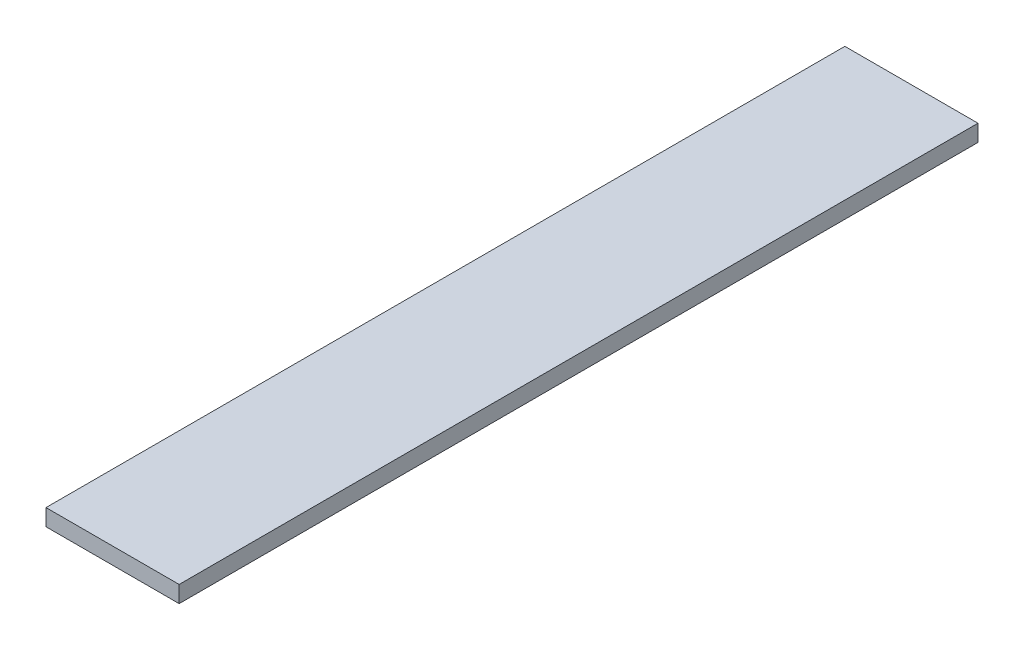
ISO-10303-21;
HEADER;
FILE_DESCRIPTION(('STEP AP214'),'2;1');
FILE_NAME('part.step','',(''),(''),'','','');
FILE_SCHEMA(('AUTOMOTIVE_DESIGN { 1 0 10303 214 1 1 1 1 }'));
ENDSEC;
DATA;
#1=APPLICATION_CONTEXT('core data for automotive mechanical design processes');
#2=APPLICATION_PROTOCOL_DEFINITION('international standard','automotive_design',2000,#1);
#3=PRODUCT_CONTEXT('',#1,'mechanical');
#4=PRODUCT('Part','Part','',(#3));
#5=PRODUCT_RELATED_PRODUCT_CATEGORY('part','',(#4));
#6=PRODUCT_DEFINITION_FORMATION('','',#4);
#7=PRODUCT_DEFINITION_CONTEXT('part definition',#1,'design');
#8=PRODUCT_DEFINITION('design','',#6,#7);
#9=PRODUCT_DEFINITION_SHAPE('','',#8);
#10=(LENGTH_UNIT() NAMED_UNIT(*) SI_UNIT(.MILLI.,.METRE.));
#11=(NAMED_UNIT(*) PLANE_ANGLE_UNIT() SI_UNIT($,.RADIAN.));
#12=(NAMED_UNIT(*) SI_UNIT($,.STERADIAN.) SOLID_ANGLE_UNIT());
#13=UNCERTAINTY_MEASURE_WITH_UNIT(LENGTH_MEASURE(1.E-05),#10,'distance_accuracy_value','');
#14=(GEOMETRIC_REPRESENTATION_CONTEXT(3) GLOBAL_UNCERTAINTY_ASSIGNED_CONTEXT((#13)) GLOBAL_UNIT_ASSIGNED_CONTEXT((#10,
#11,#12)) REPRESENTATION_CONTEXT('',''));
#15=CARTESIAN_POINT('',(0.,0.,0.));
#16=DIRECTION('',(0.,0.,1.));
#17=DIRECTION('',(1.,0.,0.));
#18=AXIS2_PLACEMENT_3D('',#15,#16,#17);
#19=CARTESIAN_POINT('',(-12.7,1.5875,76.2));
#20=DIRECTION('',(1.,0.,0.));
#21=DIRECTION('',(0.,0.,-1.));
#22=AXIS2_PLACEMENT_3D('',#19,#20,#21);
#23=PLANE('',#22);
#24=DIRECTION('',(0.,0.,-1.));
#25=VECTOR('',#24,1.);
#26=CARTESIAN_POINT('',(-12.7,1.5875,76.2));
#27=LINE('',#26,#25);
#28=CARTESIAN_POINT('',(-12.7,1.5875,76.2));
#29=VERTEX_POINT('',#28);
#30=CARTESIAN_POINT('',(-12.7,1.5875,-76.2));
#31=VERTEX_POINT('',#30);
#32=EDGE_CURVE('E89',#29,#31,#27,.T.);
#33=ORIENTED_EDGE('',*,*,#32,.T.);
#34=DIRECTION('',(0.,-1.,0.));
#35=VECTOR('',#34,1.);
#36=CARTESIAN_POINT('',(-12.7,1.5875,-76.2));
#37=LINE('',#36,#35);
#38=CARTESIAN_POINT('',(-12.7,-1.5875,-76.2));
#39=VERTEX_POINT('',#38);
#40=EDGE_CURVE('E84',#31,#39,#37,.T.);
#41=ORIENTED_EDGE('',*,*,#40,.T.);
#42=DIRECTION('',(0.,0.,-1.));
#43=VECTOR('',#42,1.);
#44=CARTESIAN_POINT('',(-12.7,-1.5875,76.2));
#45=LINE('',#44,#43);
#46=CARTESIAN_POINT('',(-12.7,-1.5875,76.2));
#47=VERTEX_POINT('',#46);
#48=EDGE_CURVE('E11',#47,#39,#45,.T.);
#49=ORIENTED_EDGE('',*,*,#48,.F.);
#50=DIRECTION('',(0.,-1.,0.));
#51=VECTOR('',#50,1.);
#52=CARTESIAN_POINT('',(-12.7,1.5875,76.2));
#53=LINE('',#52,#51);
#54=EDGE_CURVE('E95',#29,#47,#53,.T.);
#55=ORIENTED_EDGE('',*,*,#54,.F.);
#56=EDGE_LOOP('',(#33,#41,#49,#55));
#57=FACE_BOUND('',#56,.T.);
#58=ADVANCED_FACE('F32',(#57),#23,.F.);
#59=CARTESIAN_POINT('',(12.7,-1.5875,76.2));
#60=DIRECTION('',(0.,1.,0.));
#61=DIRECTION('',(0.,0.,1.));
#62=AXIS2_PLACEMENT_3D('',#59,#60,#61);
#63=PLANE('',#62);
#64=ORIENTED_EDGE('',*,*,#48,.T.);
#65=DIRECTION('',(1.,0.,0.));
#66=VECTOR('',#65,1.);
#67=CARTESIAN_POINT('',(12.7,-1.5875,-76.2));
#68=LINE('',#67,#66);
#69=CARTESIAN_POINT('',(12.7,-1.5875,-76.2));
#70=VERTEX_POINT('',#69);
#71=EDGE_CURVE('E74',#39,#70,#68,.T.);
#72=ORIENTED_EDGE('',*,*,#71,.T.);
#73=DIRECTION('',(0.,0.,-1.));
#74=VECTOR('',#73,1.);
#75=CARTESIAN_POINT('',(12.7,-1.5875,76.2));
#76=LINE('',#75,#74);
#77=CARTESIAN_POINT('',(12.7,-1.5875,76.2));
#78=VERTEX_POINT('',#77);
#79=EDGE_CURVE('E39',#78,#70,#76,.T.);
#80=ORIENTED_EDGE('',*,*,#79,.F.);
#81=DIRECTION('',(1.,0.,0.));
#82=VECTOR('',#81,1.);
#83=CARTESIAN_POINT('',(12.7,-1.5875,76.2));
#84=LINE('',#83,#82);
#85=EDGE_CURVE('E75',#47,#78,#84,.T.);
#86=ORIENTED_EDGE('',*,*,#85,.F.);
#87=EDGE_LOOP('',(#64,#72,#80,#86));
#88=FACE_BOUND('',#87,.T.);
#89=ADVANCED_FACE('F72',(#88),#63,.F.);
#90=CARTESIAN_POINT('',(12.7,1.5875,76.2));
#91=DIRECTION('',(-1.,0.,0.));
#92=DIRECTION('',(0.,0.,1.));
#93=AXIS2_PLACEMENT_3D('',#90,#91,#92);
#94=PLANE('',#93);
#95=ORIENTED_EDGE('',*,*,#79,.T.);
#96=DIRECTION('',(0.,1.,0.));
#97=VECTOR('',#96,1.);
#98=CARTESIAN_POINT('',(12.7,1.5875,-76.2));
#99=LINE('',#98,#97);
#100=CARTESIAN_POINT('',(12.7,1.5875,-76.2));
#101=VERTEX_POINT('',#100);
#102=EDGE_CURVE('E87',#70,#101,#99,.T.);
#103=ORIENTED_EDGE('',*,*,#102,.T.);
#104=DIRECTION('',(0.,0.,-1.));
#105=VECTOR('',#104,1.);
#106=CARTESIAN_POINT('',(12.7,1.5875,76.2));
#107=LINE('',#106,#105);
#108=CARTESIAN_POINT('',(12.7,1.5875,76.2));
#109=VERTEX_POINT('',#108);
#110=EDGE_CURVE('E101',#109,#101,#107,.T.);
#111=ORIENTED_EDGE('',*,*,#110,.F.);
#112=DIRECTION('',(0.,1.,0.));
#113=VECTOR('',#112,1.);
#114=CARTESIAN_POINT('',(12.7,1.5875,76.2));
#115=LINE('',#114,#113);
#116=EDGE_CURVE('E51',#78,#109,#115,.T.);
#117=ORIENTED_EDGE('',*,*,#116,.F.);
#118=EDGE_LOOP('',(#95,#103,#111,#117));
#119=FACE_BOUND('',#118,.T.);
#120=ADVANCED_FACE('F103',(#119),#94,.F.);
#121=CARTESIAN_POINT('',(12.7,1.5875,76.2));
#122=DIRECTION('',(0.,-1.,0.));
#123=DIRECTION('',(0.,0.,-1.));
#124=AXIS2_PLACEMENT_3D('',#121,#122,#123);
#125=PLANE('',#124);
#126=ORIENTED_EDGE('',*,*,#110,.T.);
#127=DIRECTION('',(-1.,0.,0.));
#128=VECTOR('',#127,1.);
#129=CARTESIAN_POINT('',(12.7,1.5875,-76.2));
#130=LINE('',#129,#128);
#131=EDGE_CURVE('E93',#101,#31,#130,.T.);
#132=ORIENTED_EDGE('',*,*,#131,.T.);
#133=ORIENTED_EDGE('',*,*,#32,.F.);
#134=DIRECTION('',(-1.,0.,0.));
#135=VECTOR('',#134,1.);
#136=CARTESIAN_POINT('',(12.7,1.5875,76.2));
#137=LINE('',#136,#135);
#138=EDGE_CURVE('E46',#109,#29,#137,.T.);
#139=ORIENTED_EDGE('',*,*,#138,.F.);
#140=EDGE_LOOP('',(#126,#132,#133,#139));
#141=FACE_BOUND('',#140,.T.);
#142=ADVANCED_FACE('F105',(#141),#125,.F.);
#143=CARTESIAN_POINT('',(0.,0.,76.2));
#144=DIRECTION('',(0.,0.,-1.));
#145=DIRECTION('',(-1.,0.,0.));
#146=AXIS2_PLACEMENT_3D('',#143,#144,#145);
#147=PLANE('',#146);
#148=ORIENTED_EDGE('',*,*,#54,.T.);
#149=ORIENTED_EDGE('',*,*,#85,.T.);
#150=ORIENTED_EDGE('',*,*,#116,.T.);
#151=ORIENTED_EDGE('',*,*,#138,.T.);
#152=EDGE_LOOP('',(#148,#149,#150,#151));
#153=FACE_BOUND('',#152,.T.);
#154=ADVANCED_FACE('F106',(#153),#147,.F.);
#155=CARTESIAN_POINT('',(0.,0.,-76.2));
#156=DIRECTION('',(0.,0.,-1.));
#157=DIRECTION('',(-1.,0.,0.));
#158=AXIS2_PLACEMENT_3D('',#155,#156,#157);
#159=PLANE('',#158);
#160=ORIENTED_EDGE('',*,*,#40,.F.);
#161=ORIENTED_EDGE('',*,*,#131,.F.);
#162=ORIENTED_EDGE('',*,*,#102,.F.);
#163=ORIENTED_EDGE('',*,*,#71,.F.);
#164=EDGE_LOOP('',(#160,#161,#162,#163));
#165=FACE_BOUND('',#164,.T.);
#166=ADVANCED_FACE('F82',(#165),#159,.T.);
#167=CLOSED_SHELL('',(#58,#89,#120,#142,#154,#166));
#168=MANIFOLD_SOLID_BREP('B2',#167);
#169=ADVANCED_BREP_SHAPE_REPRESENTATION('',(#18,#168),#14);
#170=SHAPE_DEFINITION_REPRESENTATION(#9,#169);
ENDSEC;
END-ISO-10303-21;
